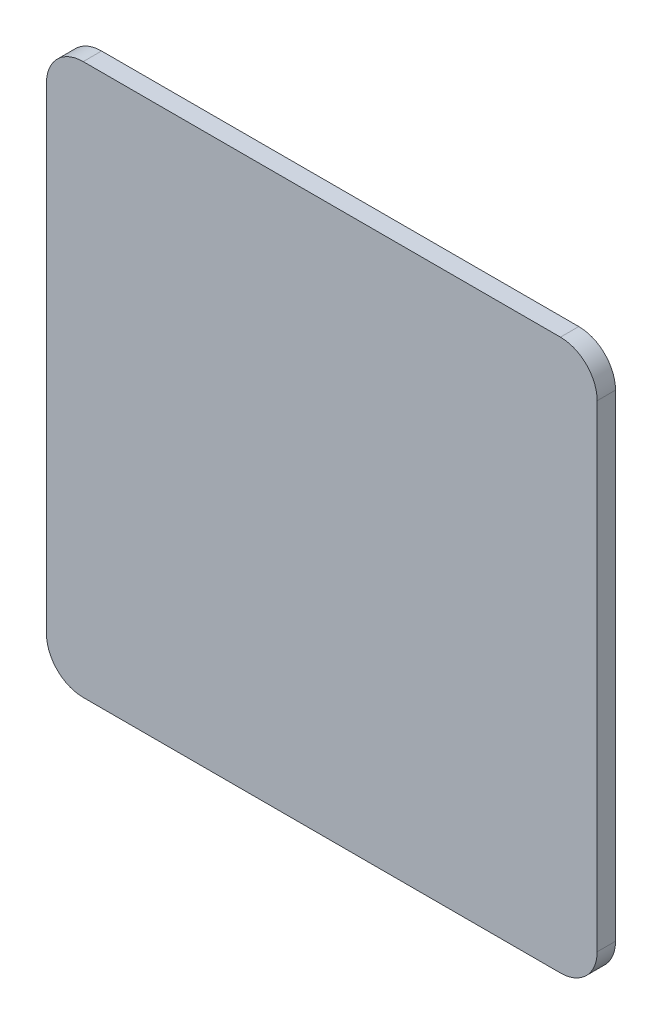
ISO-10303-21;
HEADER;
FILE_DESCRIPTION(('STEP AP214'),'2;1');
FILE_NAME('part.step','',(''),(''),'','','');
FILE_SCHEMA(('AUTOMOTIVE_DESIGN { 1 0 10303 214 1 1 1 1 }'));
ENDSEC;
DATA;
#1=APPLICATION_CONTEXT('core data for automotive mechanical design processes');
#2=APPLICATION_PROTOCOL_DEFINITION('international standard','automotive_design',2000,#1);
#3=PRODUCT_CONTEXT('',#1,'mechanical');
#4=PRODUCT('Part','Part','',(#3));
#5=PRODUCT_RELATED_PRODUCT_CATEGORY('part','',(#4));
#6=PRODUCT_DEFINITION_FORMATION('','',#4);
#7=PRODUCT_DEFINITION_CONTEXT('part definition',#1,'design');
#8=PRODUCT_DEFINITION('design','',#6,#7);
#9=PRODUCT_DEFINITION_SHAPE('','',#8);
#10=(LENGTH_UNIT() NAMED_UNIT(*) SI_UNIT(.MILLI.,.METRE.));
#11=(NAMED_UNIT(*) PLANE_ANGLE_UNIT() SI_UNIT($,.RADIAN.));
#12=(NAMED_UNIT(*) SI_UNIT($,.STERADIAN.) SOLID_ANGLE_UNIT());
#13=UNCERTAINTY_MEASURE_WITH_UNIT(LENGTH_MEASURE(1.E-05),#10,'distance_accuracy_value','');
#14=(GEOMETRIC_REPRESENTATION_CONTEXT(3) GLOBAL_UNCERTAINTY_ASSIGNED_CONTEXT((#13)) GLOBAL_UNIT_ASSIGNED_CONTEXT((#10,
#11,#12)) REPRESENTATION_CONTEXT('',''));
#15=CARTESIAN_POINT('',(0.,0.,0.));
#16=DIRECTION('',(0.,0.,1.));
#17=DIRECTION('',(1.,0.,0.));
#18=AXIS2_PLACEMENT_3D('',#15,#16,#17);
#19=CARTESIAN_POINT('',(0.,0.,1.));
#20=DIRECTION('',(1.,0.,0.));
#21=DIRECTION('',(0.,0.,-1.));
#22=AXIS2_PLACEMENT_3D('',#19,#20,#21);
#23=PLANE('',#22);
#24=DIRECTION('',(0.,-1.,0.));
#25=VECTOR('',#24,1.);
#26=CARTESIAN_POINT('',(0.,0.,0.));
#27=LINE('',#26,#25);
#28=CARTESIAN_POINT('',(0.,28.,0.));
#29=VERTEX_POINT('',#28);
#30=CARTESIAN_POINT('',(0.,2.,0.));
#31=VERTEX_POINT('',#30);
#32=EDGE_CURVE('E125',#29,#31,#27,.T.);
#33=ORIENTED_EDGE('',*,*,#32,.T.);
#34=DIRECTION('',(0.,0.,-1.));
#35=VECTOR('',#34,1.);
#36=CARTESIAN_POINT('',(0.,2.,1.));
#37=LINE('',#36,#35);
#38=CARTESIAN_POINT('',(0.,2.,1.));
#39=VERTEX_POINT('',#38);
#40=EDGE_CURVE('E103',#31,#39,#37,.F.);
#41=ORIENTED_EDGE('',*,*,#40,.T.);
#42=DIRECTION('',(0.,-1.,0.));
#43=VECTOR('',#42,1.);
#44=CARTESIAN_POINT('',(0.,0.,1.));
#45=LINE('',#44,#43);
#46=CARTESIAN_POINT('',(0.,28.,1.));
#47=VERTEX_POINT('',#46);
#48=EDGE_CURVE('E134',#47,#39,#45,.T.);
#49=ORIENTED_EDGE('',*,*,#48,.F.);
#50=DIRECTION('',(0.,0.,-1.));
#51=VECTOR('',#50,1.);
#52=CARTESIAN_POINT('',(0.,28.,1.));
#53=LINE('',#52,#51);
#54=EDGE_CURVE('E108',#47,#29,#53,.T.);
#55=ORIENTED_EDGE('',*,*,#54,.T.);
#56=EDGE_LOOP('',(#33,#41,#49,#55));
#57=FACE_BOUND('',#56,.T.);
#58=ADVANCED_FACE('F33',(#57),#23,.F.);
#59=CARTESIAN_POINT('',(0.,0.,1.));
#60=DIRECTION('',(0.,1.,0.));
#61=DIRECTION('',(0.,0.,1.));
#62=AXIS2_PLACEMENT_3D('',#59,#60,#61);
#63=PLANE('',#62);
#64=DIRECTION('',(1.,0.,0.));
#65=VECTOR('',#64,1.);
#66=CARTESIAN_POINT('',(0.,0.,1.));
#67=LINE('',#66,#65);
#68=CARTESIAN_POINT('',(2.,0.,1.));
#69=VERTEX_POINT('',#68);
#70=CARTESIAN_POINT('',(28.,0.,1.));
#71=VERTEX_POINT('',#70);
#72=EDGE_CURVE('E118',#69,#71,#67,.T.);
#73=ORIENTED_EDGE('',*,*,#72,.F.);
#74=DIRECTION('',(0.,0.,-1.));
#75=VECTOR('',#74,1.);
#76=CARTESIAN_POINT('',(2.,0.,1.));
#77=LINE('',#76,#75);
#78=CARTESIAN_POINT('',(2.,0.,0.));
#79=VERTEX_POINT('',#78);
#80=EDGE_CURVE('E102',#69,#79,#77,.T.);
#81=ORIENTED_EDGE('',*,*,#80,.T.);
#82=DIRECTION('',(1.,0.,0.));
#83=VECTOR('',#82,1.);
#84=CARTESIAN_POINT('',(0.,0.,0.));
#85=LINE('',#84,#83);
#86=CARTESIAN_POINT('',(28.,0.,0.));
#87=VERTEX_POINT('',#86);
#88=EDGE_CURVE('E115',#79,#87,#85,.T.);
#89=ORIENTED_EDGE('',*,*,#88,.T.);
#90=DIRECTION('',(0.,0.,-1.));
#91=VECTOR('',#90,1.);
#92=CARTESIAN_POINT('',(28.,0.,1.));
#93=LINE('',#92,#91);
#94=EDGE_CURVE('E120',#87,#71,#93,.F.);
#95=ORIENTED_EDGE('',*,*,#94,.T.);
#96=EDGE_LOOP('',(#73,#81,#89,#95));
#97=FACE_BOUND('',#96,.T.);
#98=ADVANCED_FACE('F114',(#97),#63,.F.);
#99=CARTESIAN_POINT('',(30.,0.,1.));
#100=DIRECTION('',(-1.,0.,0.));
#101=DIRECTION('',(0.,0.,1.));
#102=AXIS2_PLACEMENT_3D('',#99,#100,#101);
#103=PLANE('',#102);
#104=DIRECTION('',(0.,1.,0.));
#105=VECTOR('',#104,1.);
#106=CARTESIAN_POINT('',(30.,0.,1.));
#107=LINE('',#106,#105);
#108=CARTESIAN_POINT('',(30.,2.,1.));
#109=VERTEX_POINT('',#108);
#110=CARTESIAN_POINT('',(30.,28.,1.));
#111=VERTEX_POINT('',#110);
#112=EDGE_CURVE('E168',#109,#111,#107,.T.);
#113=ORIENTED_EDGE('',*,*,#112,.F.);
#114=DIRECTION('',(0.,0.,-1.));
#115=VECTOR('',#114,1.);
#116=CARTESIAN_POINT('',(30.,2.,1.));
#117=LINE('',#116,#115);
#118=CARTESIAN_POINT('',(30.,2.,0.));
#119=VERTEX_POINT('',#118);
#120=EDGE_CURVE('E153',#109,#119,#117,.T.);
#121=ORIENTED_EDGE('',*,*,#120,.T.);
#122=DIRECTION('',(0.,1.,0.));
#123=VECTOR('',#122,1.);
#124=CARTESIAN_POINT('',(30.,0.,0.));
#125=LINE('',#124,#123);
#126=CARTESIAN_POINT('',(30.,28.,0.));
#127=VERTEX_POINT('',#126);
#128=EDGE_CURVE('E124',#119,#127,#125,.T.);
#129=ORIENTED_EDGE('',*,*,#128,.T.);
#130=DIRECTION('',(0.,0.,-1.));
#131=VECTOR('',#130,1.);
#132=CARTESIAN_POINT('',(30.,28.,1.));
#133=LINE('',#132,#131);
#134=EDGE_CURVE('E151',#127,#111,#133,.F.);
#135=ORIENTED_EDGE('',*,*,#134,.T.);
#136=EDGE_LOOP('',(#113,#121,#129,#135));
#137=FACE_BOUND('',#136,.T.);
#138=ADVANCED_FACE('F179',(#137),#103,.F.);
#139=CARTESIAN_POINT('',(0.,30.,1.));
#140=DIRECTION('',(0.,-1.,0.));
#141=DIRECTION('',(0.,0.,-1.));
#142=AXIS2_PLACEMENT_3D('',#139,#140,#141);
#143=PLANE('',#142);
#144=DIRECTION('',(-1.,0.,0.));
#145=VECTOR('',#144,1.);
#146=CARTESIAN_POINT('',(0.,30.,0.));
#147=LINE('',#146,#145);
#148=CARTESIAN_POINT('',(28.,30.,0.));
#149=VERTEX_POINT('',#148);
#150=CARTESIAN_POINT('',(2.,30.,0.));
#151=VERTEX_POINT('',#150);
#152=EDGE_CURVE('E128',#149,#151,#147,.T.);
#153=ORIENTED_EDGE('',*,*,#152,.T.);
#154=DIRECTION('',(0.,0.,-1.));
#155=VECTOR('',#154,1.);
#156=CARTESIAN_POINT('',(2.,30.,1.));
#157=LINE('',#156,#155);
#158=CARTESIAN_POINT('',(2.,30.,1.));
#159=VERTEX_POINT('',#158);
#160=EDGE_CURVE('E11',#151,#159,#157,.F.);
#161=ORIENTED_EDGE('',*,*,#160,.T.);
#162=DIRECTION('',(-1.,0.,0.));
#163=VECTOR('',#162,1.);
#164=CARTESIAN_POINT('',(0.,30.,1.));
#165=LINE('',#164,#163);
#166=CARTESIAN_POINT('',(28.,30.,1.));
#167=VERTEX_POINT('',#166);
#168=EDGE_CURVE('E135',#167,#159,#165,.T.);
#169=ORIENTED_EDGE('',*,*,#168,.F.);
#170=DIRECTION('',(0.,0.,-1.));
#171=VECTOR('',#170,1.);
#172=CARTESIAN_POINT('',(28.,30.,1.));
#173=LINE('',#172,#171);
#174=EDGE_CURVE('E41',#167,#149,#173,.T.);
#175=ORIENTED_EDGE('',*,*,#174,.T.);
#176=EDGE_LOOP('',(#153,#161,#169,#175));
#177=FACE_BOUND('',#176,.T.);
#178=ADVANCED_FACE('F158',(#177),#143,.F.);
#179=CARTESIAN_POINT('',(0.,0.,1.));
#180=DIRECTION('',(0.,0.,-1.));
#181=DIRECTION('',(-1.,0.,0.));
#182=AXIS2_PLACEMENT_3D('',#179,#180,#181);
#183=PLANE('',#182);
#184=ORIENTED_EDGE('',*,*,#48,.T.);
#185=CARTESIAN_POINT('',(2.,2.,1.));
#186=DIRECTION('',(0.,0.,-1.));
#187=DIRECTION('',(-1.,0.,0.));
#188=AXIS2_PLACEMENT_3D('',#185,#186,#187);
#189=CIRCLE('',#188,2.);
#190=EDGE_CURVE('E149',#39,#69,#189,.F.);
#191=ORIENTED_EDGE('',*,*,#190,.T.);
#192=ORIENTED_EDGE('',*,*,#72,.T.);
#193=CARTESIAN_POINT('',(28.,2.,1.));
#194=DIRECTION('',(0.,0.,-1.));
#195=DIRECTION('',(-1.,0.,0.));
#196=AXIS2_PLACEMENT_3D('',#193,#194,#195);
#197=CIRCLE('',#196,2.);
#198=EDGE_CURVE('E147',#71,#109,#197,.F.);
#199=ORIENTED_EDGE('',*,*,#198,.T.);
#200=ORIENTED_EDGE('',*,*,#112,.T.);
#201=CARTESIAN_POINT('',(28.,28.,1.));
#202=DIRECTION('',(0.,0.,-1.));
#203=DIRECTION('',(-1.,0.,0.));
#204=AXIS2_PLACEMENT_3D('',#201,#202,#203);
#205=CIRCLE('',#204,2.);
#206=EDGE_CURVE('E53',#111,#167,#205,.F.);
#207=ORIENTED_EDGE('',*,*,#206,.T.);
#208=ORIENTED_EDGE('',*,*,#168,.T.);
#209=CARTESIAN_POINT('',(2.,28.,1.));
#210=DIRECTION('',(0.,0.,-1.));
#211=DIRECTION('',(-1.,0.,0.));
#212=AXIS2_PLACEMENT_3D('',#209,#210,#211);
#213=CIRCLE('',#212,2.);
#214=EDGE_CURVE('E145',#159,#47,#213,.F.);
#215=ORIENTED_EDGE('',*,*,#214,.T.);
#216=EDGE_LOOP('',(#184,#191,#192,#199,#200,#207,#208,#215));
#217=FACE_BOUND('',#216,.T.);
#218=ADVANCED_FACE('F171',(#217),#183,.F.);
#219=CARTESIAN_POINT('',(0.,0.,0.));
#220=DIRECTION('',(0.,0.,-1.));
#221=DIRECTION('',(-1.,0.,0.));
#222=AXIS2_PLACEMENT_3D('',#219,#220,#221);
#223=PLANE('',#222);
#224=ORIENTED_EDGE('',*,*,#88,.F.);
#225=CARTESIAN_POINT('',(2.,2.,0.));
#226=DIRECTION('',(0.,0.,-1.));
#227=DIRECTION('',(-1.,0.,0.));
#228=AXIS2_PLACEMENT_3D('',#225,#226,#227);
#229=CIRCLE('',#228,2.);
#230=EDGE_CURVE('E98',#79,#31,#229,.T.);
#231=ORIENTED_EDGE('',*,*,#230,.T.);
#232=ORIENTED_EDGE('',*,*,#32,.F.);
#233=CARTESIAN_POINT('',(2.,28.,0.));
#234=DIRECTION('',(0.,0.,-1.));
#235=DIRECTION('',(-1.,0.,0.));
#236=AXIS2_PLACEMENT_3D('',#233,#234,#235);
#237=CIRCLE('',#236,2.);
#238=EDGE_CURVE('E138',#29,#151,#237,.T.);
#239=ORIENTED_EDGE('',*,*,#238,.T.);
#240=ORIENTED_EDGE('',*,*,#152,.F.);
#241=CARTESIAN_POINT('',(28.,28.,0.));
#242=DIRECTION('',(0.,0.,-1.));
#243=DIRECTION('',(-1.,0.,0.));
#244=AXIS2_PLACEMENT_3D('',#241,#242,#243);
#245=CIRCLE('',#244,2.);
#246=EDGE_CURVE('E119',#149,#127,#245,.T.);
#247=ORIENTED_EDGE('',*,*,#246,.T.);
#248=ORIENTED_EDGE('',*,*,#128,.F.);
#249=CARTESIAN_POINT('',(28.,2.,0.));
#250=DIRECTION('',(0.,0.,-1.));
#251=DIRECTION('',(-1.,0.,0.));
#252=AXIS2_PLACEMENT_3D('',#249,#250,#251);
#253=CIRCLE('',#252,2.);
#254=EDGE_CURVE('E109',#119,#87,#253,.T.);
#255=ORIENTED_EDGE('',*,*,#254,.T.);
#256=EDGE_LOOP('',(#224,#231,#232,#239,#240,#247,#248,#255));
#257=FACE_BOUND('',#256,.T.);
#258=ADVANCED_FACE('F122',(#257),#223,.T.);
#259=CARTESIAN_POINT('',(2.,2.,1.));
#260=DIRECTION('',(0.,0.,-1.));
#261=DIRECTION('',(-1.,0.,0.));
#262=AXIS2_PLACEMENT_3D('',#259,#260,#261);
#263=CYLINDRICAL_SURFACE('',#262,2.);
#264=ORIENTED_EDGE('',*,*,#190,.F.);
#265=ORIENTED_EDGE('',*,*,#40,.F.);
#266=ORIENTED_EDGE('',*,*,#230,.F.);
#267=ORIENTED_EDGE('',*,*,#80,.F.);
#268=EDGE_LOOP('',(#264,#265,#266,#267));
#269=FACE_BOUND('',#268,.T.);
#270=ADVANCED_FACE('F101',(#269),#263,.T.);
#271=CARTESIAN_POINT('',(28.,2.,1.));
#272=DIRECTION('',(0.,0.,-1.));
#273=DIRECTION('',(-1.,0.,0.));
#274=AXIS2_PLACEMENT_3D('',#271,#272,#273);
#275=CYLINDRICAL_SURFACE('',#274,2.);
#276=ORIENTED_EDGE('',*,*,#198,.F.);
#277=ORIENTED_EDGE('',*,*,#94,.F.);
#278=ORIENTED_EDGE('',*,*,#254,.F.);
#279=ORIENTED_EDGE('',*,*,#120,.F.);
#280=EDGE_LOOP('',(#276,#277,#278,#279));
#281=FACE_BOUND('',#280,.T.);
#282=ADVANCED_FACE('F191',(#281),#275,.T.);
#283=CARTESIAN_POINT('',(2.,28.,1.));
#284=DIRECTION('',(0.,0.,-1.));
#285=DIRECTION('',(-1.,0.,0.));
#286=AXIS2_PLACEMENT_3D('',#283,#284,#285);
#287=CYLINDRICAL_SURFACE('',#286,2.);
#288=ORIENTED_EDGE('',*,*,#214,.F.);
#289=ORIENTED_EDGE('',*,*,#160,.F.);
#290=ORIENTED_EDGE('',*,*,#238,.F.);
#291=ORIENTED_EDGE('',*,*,#54,.F.);
#292=EDGE_LOOP('',(#288,#289,#290,#291));
#293=FACE_BOUND('',#292,.T.);
#294=ADVANCED_FACE('F163',(#293),#287,.T.);
#295=CARTESIAN_POINT('',(28.,28.,1.));
#296=DIRECTION('',(0.,0.,-1.));
#297=DIRECTION('',(-1.,0.,0.));
#298=AXIS2_PLACEMENT_3D('',#295,#296,#297);
#299=CYLINDRICAL_SURFACE('',#298,2.);
#300=ORIENTED_EDGE('',*,*,#206,.F.);
#301=ORIENTED_EDGE('',*,*,#134,.F.);
#302=ORIENTED_EDGE('',*,*,#246,.F.);
#303=ORIENTED_EDGE('',*,*,#174,.F.);
#304=EDGE_LOOP('',(#300,#301,#302,#303));
#305=FACE_BOUND('',#304,.T.);
#306=ADVANCED_FACE('F35',(#305),#299,.T.);
#307=CLOSED_SHELL('',(#58,#98,#138,#178,#218,#258,#270,#282,#294,#306));
#308=MANIFOLD_SOLID_BREP('B2',#307);
#309=ADVANCED_BREP_SHAPE_REPRESENTATION('',(#18,#308),#14);
#310=SHAPE_DEFINITION_REPRESENTATION(#9,#309);
ENDSEC;
END-ISO-10303-21;
